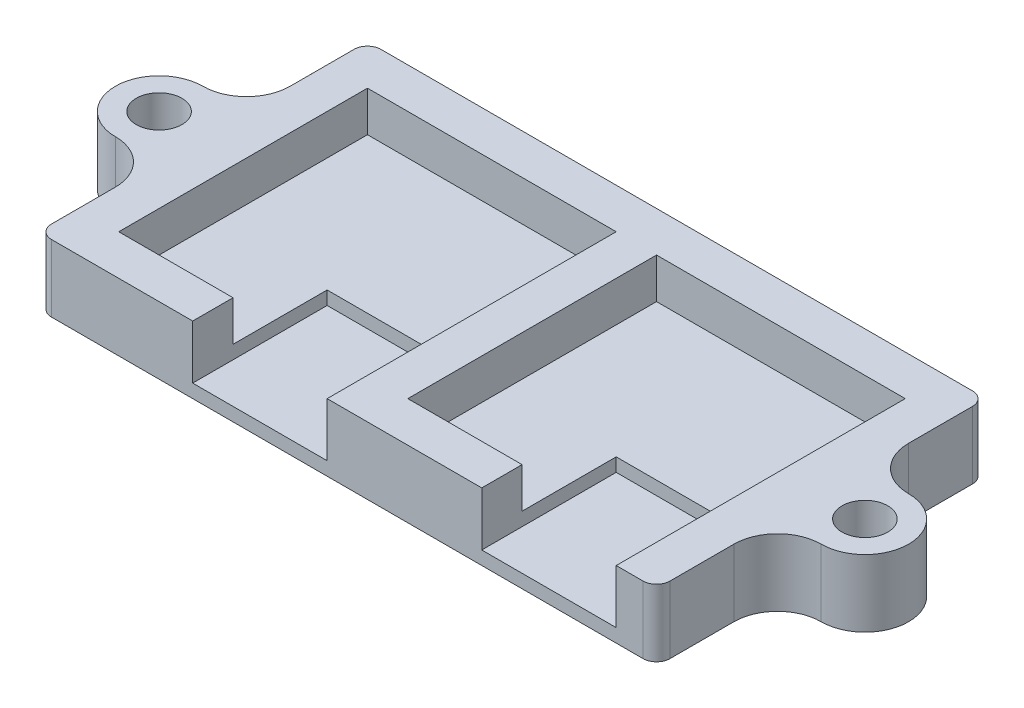
ISO-10303-21;
HEADER;
FILE_DESCRIPTION(('STEP AP214'),'2;1');
FILE_NAME('part.step','',(''),(''),'','','');
FILE_SCHEMA(('AUTOMOTIVE_DESIGN { 1 0 10303 214 1 1 1 1 }'));
ENDSEC;
DATA;
#1=APPLICATION_CONTEXT('core data for automotive mechanical design processes');
#2=APPLICATION_PROTOCOL_DEFINITION('international standard','automotive_design',2000,#1);
#3=PRODUCT_CONTEXT('',#1,'mechanical');
#4=PRODUCT('Part','Part','',(#3));
#5=PRODUCT_RELATED_PRODUCT_CATEGORY('part','',(#4));
#6=PRODUCT_DEFINITION_FORMATION('','',#4);
#7=PRODUCT_DEFINITION_CONTEXT('part definition',#1,'design');
#8=PRODUCT_DEFINITION('design','',#6,#7);
#9=PRODUCT_DEFINITION_SHAPE('','',#8);
#10=(LENGTH_UNIT() NAMED_UNIT(*) SI_UNIT(.MILLI.,.METRE.));
#11=(NAMED_UNIT(*) PLANE_ANGLE_UNIT() SI_UNIT($,.RADIAN.));
#12=(NAMED_UNIT(*) SI_UNIT($,.STERADIAN.) SOLID_ANGLE_UNIT());
#13=UNCERTAINTY_MEASURE_WITH_UNIT(LENGTH_MEASURE(1.E-05),#10,'distance_accuracy_value','');
#14=(GEOMETRIC_REPRESENTATION_CONTEXT(3) GLOBAL_UNCERTAINTY_ASSIGNED_CONTEXT((#13)) GLOBAL_UNIT_ASSIGNED_CONTEXT((#10,
#11,#12)) REPRESENTATION_CONTEXT('',''));
#15=CARTESIAN_POINT('',(0.,0.,0.));
#16=DIRECTION('',(0.,0.,1.));
#17=DIRECTION('',(1.,0.,0.));
#18=AXIS2_PLACEMENT_3D('',#15,#16,#17);
#19=CARTESIAN_POINT('',(-22.,2.,11.25));
#20=DIRECTION('',(0.,1.,0.));
#21=DIRECTION('',(0.,0.,1.));
#22=AXIS2_PLACEMENT_3D('',#19,#20,#21);
#23=PLANE('',#22);
#24=DIRECTION('',(1.,0.,0.));
#25=VECTOR('',#24,1.);
#26=CARTESIAN_POINT('',(0.,2.,2.25));
#27=LINE('',#26,#25);
#28=CARTESIAN_POINT('',(10.,2.,2.25));
#29=VERTEX_POINT('',#28);
#30=CARTESIAN_POINT('',(20.,2.,2.25));
#31=VERTEX_POINT('',#30);
#32=EDGE_CURVE('E873',#29,#31,#27,.T.);
#33=ORIENTED_EDGE('',*,*,#32,.T.);
#34=DIRECTION('',(0.,0.,-1.));
#35=VECTOR('',#34,1.);
#36=CARTESIAN_POINT('',(20.,2.,11.25));
#37=LINE('',#36,#35);
#38=CARTESIAN_POINT('',(20.,2.,-9.25));
#39=VERTEX_POINT('',#38);
#40=EDGE_CURVE('E12',#31,#39,#37,.T.);
#41=ORIENTED_EDGE('',*,*,#40,.T.);
#42=DIRECTION('',(-1.,0.,0.));
#43=VECTOR('',#42,1.);
#44=CARTESIAN_POINT('',(-22.,2.,-9.25));
#45=LINE('',#44,#43);
#46=CARTESIAN_POINT('',(1.5,2.,-9.25));
#47=VERTEX_POINT('',#46);
#48=EDGE_CURVE('E488',#39,#47,#45,.T.);
#49=ORIENTED_EDGE('',*,*,#48,.T.);
#50=DIRECTION('',(0.,0.,-1.));
#51=VECTOR('',#50,1.);
#52=CARTESIAN_POINT('',(1.5,2.,11.25));
#53=LINE('',#52,#51);
#54=CARTESIAN_POINT('',(1.5,2.,9.25));
#55=VERTEX_POINT('',#54);
#56=EDGE_CURVE('E825',#55,#47,#53,.T.);
#57=ORIENTED_EDGE('',*,*,#56,.F.);
#58=DIRECTION('',(-1.,0.,0.));
#59=VECTOR('',#58,1.);
#60=CARTESIAN_POINT('',(-22.,2.,9.25));
#61=LINE('',#60,#59);
#62=CARTESIAN_POINT('',(10.,2.,9.25));
#63=VERTEX_POINT('',#62);
#64=EDGE_CURVE('E819',#63,#55,#61,.T.);
#65=ORIENTED_EDGE('',*,*,#64,.F.);
#66=DIRECTION('',(0.,0.,1.));
#67=VECTOR('',#66,1.);
#68=CARTESIAN_POINT('',(10.,2.,0.));
#69=LINE('',#68,#67);
#70=EDGE_CURVE('E869',#29,#63,#69,.T.);
#71=ORIENTED_EDGE('',*,*,#70,.F.);
#72=EDGE_LOOP('',(#33,#41,#49,#57,#65,#71));
#73=FACE_BOUND('',#72,.T.);
#74=ADVANCED_FACE('F467',(#73),#23,.T.);
#75=DIRECTION('',(1.,0.,0.));
#76=VECTOR('',#75,1.);
#77=CARTESIAN_POINT('',(0.,2.,2.25));
#78=LINE('',#77,#76);
#79=CARTESIAN_POINT('',(-11.5,2.,2.25));
#80=VERTEX_POINT('',#79);
#81=CARTESIAN_POINT('',(-1.5,2.,2.25));
#82=VERTEX_POINT('',#81);
#83=EDGE_CURVE('E865',#80,#82,#78,.T.);
#84=ORIENTED_EDGE('',*,*,#83,.T.);
#85=DIRECTION('',(0.,0.,-1.));
#86=VECTOR('',#85,1.);
#87=CARTESIAN_POINT('',(-1.5,2.,11.25));
#88=LINE('',#87,#86);
#89=CARTESIAN_POINT('',(-1.5,2.,-9.25));
#90=VERTEX_POINT('',#89);
#91=EDGE_CURVE('E477',#82,#90,#88,.T.);
#92=ORIENTED_EDGE('',*,*,#91,.T.);
#93=DIRECTION('',(-1.,0.,0.));
#94=VECTOR('',#93,1.);
#95=CARTESIAN_POINT('',(-22.,2.,-9.25));
#96=LINE('',#95,#94);
#97=CARTESIAN_POINT('',(-20.,2.,-9.25));
#98=VERTEX_POINT('',#97);
#99=EDGE_CURVE('E816',#90,#98,#96,.T.);
#100=ORIENTED_EDGE('',*,*,#99,.T.);
#101=DIRECTION('',(0.,0.,-1.));
#102=VECTOR('',#101,1.);
#103=CARTESIAN_POINT('',(-20.,2.,11.25));
#104=LINE('',#103,#102);
#105=CARTESIAN_POINT('',(-20.,2.,9.25));
#106=VERTEX_POINT('',#105);
#107=EDGE_CURVE('E811',#106,#98,#104,.T.);
#108=ORIENTED_EDGE('',*,*,#107,.F.);
#109=DIRECTION('',(-1.,0.,0.));
#110=VECTOR('',#109,1.);
#111=CARTESIAN_POINT('',(-22.,2.,9.25));
#112=LINE('',#111,#110);
#113=CARTESIAN_POINT('',(-11.5,2.,9.25));
#114=VERTEX_POINT('',#113);
#115=EDGE_CURVE('E807',#114,#106,#112,.T.);
#116=ORIENTED_EDGE('',*,*,#115,.F.);
#117=DIRECTION('',(0.,0.,1.));
#118=VECTOR('',#117,1.);
#119=CARTESIAN_POINT('',(-11.5,2.,0.));
#120=LINE('',#119,#118);
#121=EDGE_CURVE('E861',#80,#114,#120,.T.);
#122=ORIENTED_EDGE('',*,*,#121,.F.);
#123=EDGE_LOOP('',(#84,#92,#100,#108,#116,#122));
#124=FACE_BOUND('',#123,.T.);
#125=ADVANCED_FACE('F1129',(#124),#23,.T.);
#126=CARTESIAN_POINT('',(0.,1.,0.));
#127=DIRECTION('',(0.,1.,0.));
#128=DIRECTION('',(0.,0.,1.));
#129=AXIS2_PLACEMENT_3D('',#126,#127,#128);
#130=PLANE('',#129);
#131=DIRECTION('',(-1.,0.,0.));
#132=VECTOR('',#131,1.);
#133=CARTESIAN_POINT('',(0.,1.,12.25));
#134=LINE('',#133,#132);
#135=CARTESIAN_POINT('',(20.,1.,12.25));
#136=VERTEX_POINT('',#135);
#137=CARTESIAN_POINT('',(10.,1.,12.25));
#138=VERTEX_POINT('',#137);
#139=EDGE_CURVE('E927',#136,#138,#134,.T.);
#140=ORIENTED_EDGE('',*,*,#139,.F.);
#141=DIRECTION('',(0.,0.,-1.));
#142=VECTOR('',#141,1.);
#143=CARTESIAN_POINT('',(20.,1.,0.));
#144=LINE('',#143,#142);
#145=CARTESIAN_POINT('',(20.,1.,2.25));
#146=VERTEX_POINT('',#145);
#147=EDGE_CURVE('E866',#136,#146,#144,.T.);
#148=ORIENTED_EDGE('',*,*,#147,.T.);
#149=DIRECTION('',(1.,0.,0.));
#150=VECTOR('',#149,1.);
#151=CARTESIAN_POINT('',(0.,1.,2.25));
#152=LINE('',#151,#150);
#153=CARTESIAN_POINT('',(10.,1.,2.25));
#154=VERTEX_POINT('',#153);
#155=EDGE_CURVE('E892',#154,#146,#152,.T.);
#156=ORIENTED_EDGE('',*,*,#155,.F.);
#157=DIRECTION('',(0.,0.,1.));
#158=VECTOR('',#157,1.);
#159=CARTESIAN_POINT('',(10.,1.,0.));
#160=LINE('',#159,#158);
#161=EDGE_CURVE('E888',#154,#138,#160,.T.);
#162=ORIENTED_EDGE('',*,*,#161,.T.);
#163=EDGE_LOOP('',(#140,#148,#156,#162));
#164=FACE_BOUND('',#163,.T.);
#165=ADVANCED_FACE('F1072',(#164),#130,.T.);
#166=CARTESIAN_POINT('',(-1.5,1.,12.25));
#167=VERTEX_POINT('',#166);
#168=CARTESIAN_POINT('',(-11.5,1.,12.25));
#169=VERTEX_POINT('',#168);
#170=EDGE_CURVE('E923',#167,#169,#134,.T.);
#171=ORIENTED_EDGE('',*,*,#170,.F.);
#172=DIRECTION('',(0.,0.,-1.));
#173=VECTOR('',#172,1.);
#174=CARTESIAN_POINT('',(-1.5,1.,0.));
#175=LINE('',#174,#173);
#176=CARTESIAN_POINT('',(-1.5,1.,2.25));
#177=VERTEX_POINT('',#176);
#178=EDGE_CURVE('E884',#167,#177,#175,.T.);
#179=ORIENTED_EDGE('',*,*,#178,.T.);
#180=DIRECTION('',(1.,0.,0.));
#181=VECTOR('',#180,1.);
#182=CARTESIAN_POINT('',(0.,1.,2.25));
#183=LINE('',#182,#181);
#184=CARTESIAN_POINT('',(-11.5,1.,2.25));
#185=VERTEX_POINT('',#184);
#186=EDGE_CURVE('E880',#185,#177,#183,.T.);
#187=ORIENTED_EDGE('',*,*,#186,.F.);
#188=DIRECTION('',(0.,0.,1.));
#189=VECTOR('',#188,1.);
#190=CARTESIAN_POINT('',(-11.5,1.,0.));
#191=LINE('',#190,#189);
#192=EDGE_CURVE('E860',#185,#169,#191,.T.);
#193=ORIENTED_EDGE('',*,*,#192,.T.);
#194=EDGE_LOOP('',(#171,#179,#187,#193));
#195=FACE_BOUND('',#194,.T.);
#196=ADVANCED_FACE('F1091',(#195),#130,.T.);
#197=CARTESIAN_POINT('',(-22.,1.,11.25));
#198=DIRECTION('',(0.,-1.,0.));
#199=DIRECTION('',(0.,0.,-1.));
#200=AXIS2_PLACEMENT_3D('',#197,#198,#199);
#201=CYLINDRICAL_SURFACE('',#200,1.);
#202=CARTESIAN_POINT('',(-22.,0.,11.25));
#203=DIRECTION('',(0.,1.,0.));
#204=DIRECTION('',(0.,0.,1.));
#205=AXIS2_PLACEMENT_3D('',#202,#203,#204);
#206=CIRCLE('',#205,1.);
#207=CARTESIAN_POINT('',(-22.,0.,12.25));
#208=VERTEX_POINT('',#207);
#209=CARTESIAN_POINT('',(-23.,0.,11.25));
#210=VERTEX_POINT('',#209);
#211=EDGE_CURVE('E922',#208,#210,#206,.F.);
#212=ORIENTED_EDGE('',*,*,#211,.F.);
#213=DIRECTION('',(0.,-1.,0.));
#214=VECTOR('',#213,1.);
#215=CARTESIAN_POINT('',(-22.,1.,12.25));
#216=LINE('',#215,#214);
#217=CARTESIAN_POINT('',(-22.,5.,12.25));
#218=VERTEX_POINT('',#217);
#219=EDGE_CURVE('E471',#218,#208,#216,.T.);
#220=ORIENTED_EDGE('',*,*,#219,.F.);
#221=CARTESIAN_POINT('',(-22.,5.,11.25));
#222=DIRECTION('',(0.,1.,0.));
#223=DIRECTION('',(0.,0.,1.));
#224=AXIS2_PLACEMENT_3D('',#221,#222,#223);
#225=CIRCLE('',#224,1.);
#226=CARTESIAN_POINT('',(-23.,5.,11.25));
#227=VERTEX_POINT('',#226);
#228=EDGE_CURVE('E732',#227,#218,#225,.T.);
#229=ORIENTED_EDGE('',*,*,#228,.F.);
#230=DIRECTION('',(0.,-1.,0.));
#231=VECTOR('',#230,1.);
#232=CARTESIAN_POINT('',(-23.,1.,11.25));
#233=LINE('',#232,#231);
#234=EDGE_CURVE('E987',#227,#210,#233,.T.);
#235=ORIENTED_EDGE('',*,*,#234,.T.);
#236=EDGE_LOOP('',(#212,#220,#229,#235));
#237=FACE_BOUND('',#236,.T.);
#238=ADVANCED_FACE('F469',(#237),#201,.T.);
#239=CARTESIAN_POINT('',(0.,1.,12.25));
#240=DIRECTION('',(0.,0.,1.));
#241=DIRECTION('',(1.,0.,0.));
#242=AXIS2_PLACEMENT_3D('',#239,#240,#241);
#243=PLANE('',#242);
#244=DIRECTION('',(-1.,0.,0.));
#245=VECTOR('',#244,1.);
#246=CARTESIAN_POINT('',(0.,0.,12.25));
#247=LINE('',#246,#245);
#248=CARTESIAN_POINT('',(22.,0.,12.25));
#249=VERTEX_POINT('',#248);
#250=EDGE_CURVE('E932',#249,#208,#247,.T.);
#251=ORIENTED_EDGE('',*,*,#250,.F.);
#252=DIRECTION('',(0.,-1.,0.));
#253=VECTOR('',#252,1.);
#254=CARTESIAN_POINT('',(22.,1.,12.25));
#255=LINE('',#254,#253);
#256=CARTESIAN_POINT('',(22.,5.,12.25));
#257=VERTEX_POINT('',#256);
#258=EDGE_CURVE('E1026',#257,#249,#255,.T.);
#259=ORIENTED_EDGE('',*,*,#258,.F.);
#260=DIRECTION('',(1.,0.,0.));
#261=VECTOR('',#260,1.);
#262=CARTESIAN_POINT('',(-22.,5.,12.25));
#263=LINE('',#262,#261);
#264=CARTESIAN_POINT('',(20.,5.,12.25));
#265=VERTEX_POINT('',#264);
#266=EDGE_CURVE('E780',#265,#257,#263,.T.);
#267=ORIENTED_EDGE('',*,*,#266,.F.);
#268=DIRECTION('',(0.,-1.,0.));
#269=VECTOR('',#268,1.);
#270=CARTESIAN_POINT('',(20.,2.,12.25));
#271=LINE('',#270,#269);
#272=EDGE_CURVE('E876',#265,#136,#271,.T.);
#273=ORIENTED_EDGE('',*,*,#272,.T.);
#274=ORIENTED_EDGE('',*,*,#139,.T.);
#275=DIRECTION('',(0.,-1.,0.));
#276=VECTOR('',#275,1.);
#277=CARTESIAN_POINT('',(10.,2.,12.25));
#278=LINE('',#277,#276);
#279=CARTESIAN_POINT('',(10.,5.,12.25));
#280=VERTEX_POINT('',#279);
#281=EDGE_CURVE('E907',#280,#138,#278,.T.);
#282=ORIENTED_EDGE('',*,*,#281,.F.);
#283=DIRECTION('',(1.,0.,0.));
#284=VECTOR('',#283,1.);
#285=CARTESIAN_POINT('',(-22.,5.,12.25));
#286=LINE('',#285,#284);
#287=CARTESIAN_POINT('',(-1.5,5.,12.25));
#288=VERTEX_POINT('',#287);
#289=EDGE_CURVE('E758',#288,#280,#286,.T.);
#290=ORIENTED_EDGE('',*,*,#289,.F.);
#291=DIRECTION('',(0.,-1.,0.));
#292=VECTOR('',#291,1.);
#293=CARTESIAN_POINT('',(-1.5,2.,12.25));
#294=LINE('',#293,#292);
#295=EDGE_CURVE('E910',#288,#167,#294,.T.);
#296=ORIENTED_EDGE('',*,*,#295,.T.);
#297=ORIENTED_EDGE('',*,*,#170,.T.);
#298=DIRECTION('',(0.,-1.,0.));
#299=VECTOR('',#298,1.);
#300=CARTESIAN_POINT('',(-11.5,2.,12.25));
#301=LINE('',#300,#299);
#302=CARTESIAN_POINT('',(-11.5,5.,12.25));
#303=VERTEX_POINT('',#302);
#304=EDGE_CURVE('E919',#303,#169,#301,.T.);
#305=ORIENTED_EDGE('',*,*,#304,.F.);
#306=DIRECTION('',(1.,0.,0.));
#307=VECTOR('',#306,1.);
#308=CARTESIAN_POINT('',(-22.,5.,12.25));
#309=LINE('',#308,#307);
#310=EDGE_CURVE('E736',#218,#303,#309,.T.);
#311=ORIENTED_EDGE('',*,*,#310,.F.);
#312=ORIENTED_EDGE('',*,*,#219,.T.);
#313=EDGE_LOOP('',(#251,#259,#267,#273,#274,#282,#290,#296,#297,#305,#311,#312));
#314=FACE_BOUND('',#313,.T.);
#315=ADVANCED_FACE('F1036',(#314),#243,.T.);
#316=CARTESIAN_POINT('',(22.,1.,11.25));
#317=DIRECTION('',(0.,-1.,0.));
#318=DIRECTION('',(0.,0.,-1.));
#319=AXIS2_PLACEMENT_3D('',#316,#317,#318);
#320=CYLINDRICAL_SURFACE('',#319,1.);
#321=CARTESIAN_POINT('',(22.,0.,11.25));
#322=DIRECTION('',(0.,1.,0.));
#323=DIRECTION('',(0.,0.,1.));
#324=AXIS2_PLACEMENT_3D('',#321,#322,#323);
#325=CIRCLE('',#324,1.);
#326=CARTESIAN_POINT('',(23.,0.,11.25));
#327=VERTEX_POINT('',#326);
#328=EDGE_CURVE('E936',#249,#327,#325,.T.);
#329=ORIENTED_EDGE('',*,*,#328,.T.);
#330=DIRECTION('',(0.,-1.,0.));
#331=VECTOR('',#330,1.);
#332=CARTESIAN_POINT('',(23.,1.,11.25));
#333=LINE('',#332,#331);
#334=CARTESIAN_POINT('',(23.,5.,11.25));
#335=VERTEX_POINT('',#334);
#336=EDGE_CURVE('E1023',#335,#327,#333,.T.);
#337=ORIENTED_EDGE('',*,*,#336,.F.);
#338=CARTESIAN_POINT('',(22.,5.,11.25));
#339=DIRECTION('',(0.,1.,0.));
#340=DIRECTION('',(0.,0.,1.));
#341=AXIS2_PLACEMENT_3D('',#338,#339,#340);
#342=CIRCLE('',#341,1.);
#343=EDGE_CURVE('E784',#257,#335,#342,.T.);
#344=ORIENTED_EDGE('',*,*,#343,.F.);
#345=ORIENTED_EDGE('',*,*,#258,.T.);
#346=EDGE_LOOP('',(#329,#337,#344,#345));
#347=FACE_BOUND('',#346,.T.);
#348=ADVANCED_FACE('F1046',(#347),#320,.T.);
#349=CARTESIAN_POINT('',(23.,1.,0.));
#350=DIRECTION('',(-1.,0.,0.));
#351=DIRECTION('',(0.,0.,1.));
#352=AXIS2_PLACEMENT_3D('',#349,#350,#351);
#353=PLANE('',#352);
#354=DIRECTION('',(0.,0.,-1.));
#355=VECTOR('',#354,1.);
#356=CARTESIAN_POINT('',(23.,0.,0.));
#357=LINE('',#356,#355);
#358=CARTESIAN_POINT('',(23.,0.,6.49999999999983));
#359=VERTEX_POINT('',#358);
#360=EDGE_CURVE('E939',#327,#359,#357,.T.);
#361=ORIENTED_EDGE('',*,*,#360,.T.);
#362=DIRECTION('',(0.,-1.,0.));
#363=VECTOR('',#362,1.);
#364=CARTESIAN_POINT('',(23.,1.,6.49999999999983));
#365=LINE('',#364,#363);
#366=CARTESIAN_POINT('',(23.,5.,6.49999999999983));
#367=VERTEX_POINT('',#366);
#368=EDGE_CURVE('E1019',#367,#359,#365,.T.);
#369=ORIENTED_EDGE('',*,*,#368,.F.);
#370=DIRECTION('',(0.,0.,1.));
#371=VECTOR('',#370,1.);
#372=CARTESIAN_POINT('',(23.,5.,11.25));
#373=LINE('',#372,#371);
#374=EDGE_CURVE('E788',#367,#335,#373,.T.);
#375=ORIENTED_EDGE('',*,*,#374,.T.);
#376=ORIENTED_EDGE('',*,*,#336,.T.);
#377=EDGE_LOOP('',(#361,#369,#375,#376));
#378=FACE_BOUND('',#377,.T.);
#379=ADVANCED_FACE('F1048',(#378),#353,.F.);
#380=CARTESIAN_POINT('',(26.25,1.,6.49999999999983));
#381=DIRECTION('',(0.,-1.,0.));
#382=DIRECTION('',(0.,0.,-1.));
#383=AXIS2_PLACEMENT_3D('',#380,#381,#382);
#384=CYLINDRICAL_SURFACE('',#383,3.25);
#385=CARTESIAN_POINT('',(26.25,0.,6.49999999999983));
#386=DIRECTION('',(0.,1.,0.));
#387=DIRECTION('',(0.,0.,1.));
#388=AXIS2_PLACEMENT_3D('',#385,#386,#387);
#389=CIRCLE('',#388,3.25);
#390=CARTESIAN_POINT('',(26.25,0.,3.24999999999983));
#391=VERTEX_POINT('',#390);
#392=EDGE_CURVE('E942',#359,#391,#389,.F.);
#393=ORIENTED_EDGE('',*,*,#392,.T.);
#394=DIRECTION('',(0.,-1.,0.));
#395=VECTOR('',#394,1.);
#396=CARTESIAN_POINT('',(26.25,1.,3.24999999999983));
#397=LINE('',#396,#395);
#398=CARTESIAN_POINT('',(26.25,5.,3.24999999999983));
#399=VERTEX_POINT('',#398);
#400=EDGE_CURVE('E1016',#399,#391,#397,.T.);
#401=ORIENTED_EDGE('',*,*,#400,.F.);
#402=CARTESIAN_POINT('',(26.25,5.,6.49999999999983));
#403=DIRECTION('',(0.,1.,0.));
#404=DIRECTION('',(0.,0.,1.));
#405=AXIS2_PLACEMENT_3D('',#402,#403,#404);
#406=CIRCLE('',#405,3.25);
#407=EDGE_CURVE('E792',#399,#367,#406,.T.);
#408=ORIENTED_EDGE('',*,*,#407,.T.);
#409=ORIENTED_EDGE('',*,*,#368,.T.);
#410=EDGE_LOOP('',(#393,#401,#408,#409));
#411=FACE_BOUND('',#410,.T.);
#412=ADVANCED_FACE('F1052',(#411),#384,.F.);
#413=CARTESIAN_POINT('',(26.25,1.,-1.66533453693773E-13));
#414=DIRECTION('',(0.,-1.,0.));
#415=DIRECTION('',(0.,0.,-1.));
#416=AXIS2_PLACEMENT_3D('',#413,#414,#415);
#417=CYLINDRICAL_SURFACE('',#416,3.25);
#418=CARTESIAN_POINT('',(26.25,0.,-1.66533453693773E-13));
#419=DIRECTION('',(0.,1.,0.));
#420=DIRECTION('',(0.,0.,1.));
#421=AXIS2_PLACEMENT_3D('',#418,#419,#420);
#422=CIRCLE('',#421,3.25);
#423=CARTESIAN_POINT('',(26.25,0.,-3.25000000000017));
#424=VERTEX_POINT('',#423);
#425=EDGE_CURVE('E947',#424,#391,#422,.F.);
#426=ORIENTED_EDGE('',*,*,#425,.F.);
#427=DIRECTION('',(0.,-1.,0.));
#428=VECTOR('',#427,1.);
#429=CARTESIAN_POINT('',(26.25,1.,-3.25000000000017));
#430=LINE('',#429,#428);
#431=CARTESIAN_POINT('',(26.25,5.,-3.25000000000017));
#432=VERTEX_POINT('',#431);
#433=EDGE_CURVE('E1013',#432,#424,#430,.T.);
#434=ORIENTED_EDGE('',*,*,#433,.F.);
#435=CARTESIAN_POINT('',(26.25,5.,-1.66533453693773E-13));
#436=DIRECTION('',(0.,1.,0.));
#437=DIRECTION('',(0.,0.,1.));
#438=AXIS2_PLACEMENT_3D('',#435,#436,#437);
#439=CIRCLE('',#438,3.25);
#440=EDGE_CURVE('E796',#399,#432,#439,.T.);
#441=ORIENTED_EDGE('',*,*,#440,.F.);
#442=ORIENTED_EDGE('',*,*,#400,.T.);
#443=EDGE_LOOP('',(#426,#434,#441,#442));
#444=FACE_BOUND('',#443,.T.);
#445=ADVANCED_FACE('F1056',(#444),#417,.T.);
#446=CARTESIAN_POINT('',(26.25,1.,-6.50000000000017));
#447=DIRECTION('',(0.,-1.,0.));
#448=DIRECTION('',(0.,0.,-1.));
#449=AXIS2_PLACEMENT_3D('',#446,#447,#448);
#450=CYLINDRICAL_SURFACE('',#449,3.25);
#451=CARTESIAN_POINT('',(26.25,0.,-6.50000000000017));
#452=DIRECTION('',(0.,1.,0.));
#453=DIRECTION('',(0.,0.,1.));
#454=AXIS2_PLACEMENT_3D('',#451,#452,#453);
#455=CIRCLE('',#454,3.25);
#456=CARTESIAN_POINT('',(23.,0.,-6.50000000000017));
#457=VERTEX_POINT('',#456);
#458=EDGE_CURVE('E951',#424,#457,#455,.F.);
#459=ORIENTED_EDGE('',*,*,#458,.T.);
#460=DIRECTION('',(0.,-1.,0.));
#461=VECTOR('',#460,1.);
#462=CARTESIAN_POINT('',(23.,1.,-6.50000000000017));
#463=LINE('',#462,#461);
#464=CARTESIAN_POINT('',(23.,5.,-6.50000000000017));
#465=VERTEX_POINT('',#464);
#466=EDGE_CURVE('E1009',#465,#457,#463,.T.);
#467=ORIENTED_EDGE('',*,*,#466,.F.);
#468=CARTESIAN_POINT('',(26.25,5.,-6.50000000000017));
#469=DIRECTION('',(0.,1.,0.));
#470=DIRECTION('',(0.,0.,1.));
#471=AXIS2_PLACEMENT_3D('',#468,#469,#470);
#472=CIRCLE('',#471,3.25);
#473=EDGE_CURVE('E800',#465,#432,#472,.T.);
#474=ORIENTED_EDGE('',*,*,#473,.T.);
#475=ORIENTED_EDGE('',*,*,#433,.T.);
#476=EDGE_LOOP('',(#459,#467,#474,#475));
#477=FACE_BOUND('',#476,.T.);
#478=ADVANCED_FACE('F1058',(#477),#450,.F.);
#479=CARTESIAN_POINT('',(23.,0.,-11.25));
#480=VERTEX_POINT('',#479);
#481=EDGE_CURVE('E943',#457,#480,#357,.T.);
#482=ORIENTED_EDGE('',*,*,#481,.T.);
#483=DIRECTION('',(0.,-1.,0.));
#484=VECTOR('',#483,1.);
#485=CARTESIAN_POINT('',(23.,1.,-11.25));
#486=LINE('',#485,#484);
#487=CARTESIAN_POINT('',(23.,5.,-11.25));
#488=VERTEX_POINT('',#487);
#489=EDGE_CURVE('E688',#488,#480,#486,.T.);
#490=ORIENTED_EDGE('',*,*,#489,.F.);
#491=DIRECTION('',(0.,0.,1.));
#492=VECTOR('',#491,1.);
#493=CARTESIAN_POINT('',(23.,5.,11.25));
#494=LINE('',#493,#492);
#495=EDGE_CURVE('E699',#488,#465,#494,.T.);
#496=ORIENTED_EDGE('',*,*,#495,.T.);
#497=ORIENTED_EDGE('',*,*,#466,.T.);
#498=EDGE_LOOP('',(#482,#490,#496,#497));
#499=FACE_BOUND('',#498,.T.);
#500=ADVANCED_FACE('F1062',(#499),#353,.F.);
#501=CARTESIAN_POINT('',(22.,1.,-11.25));
#502=DIRECTION('',(0.,-1.,0.));
#503=DIRECTION('',(0.,0.,-1.));
#504=AXIS2_PLACEMENT_3D('',#501,#502,#503);
#505=CYLINDRICAL_SURFACE('',#504,1.);
#506=CARTESIAN_POINT('',(22.,0.,-11.25));
#507=DIRECTION('',(0.,1.,0.));
#508=DIRECTION('',(0.,0.,1.));
#509=AXIS2_PLACEMENT_3D('',#506,#507,#508);
#510=CIRCLE('',#509,1.);
#511=CARTESIAN_POINT('',(22.,0.,-12.25));
#512=VERTEX_POINT('',#511);
#513=EDGE_CURVE('E683',#480,#512,#510,.T.);
#514=ORIENTED_EDGE('',*,*,#513,.T.);
#515=DIRECTION('',(0.,-1.,0.));
#516=VECTOR('',#515,1.);
#517=CARTESIAN_POINT('',(22.,1.,-12.25));
#518=LINE('',#517,#516);
#519=CARTESIAN_POINT('',(22.,5.,-12.25));
#520=VERTEX_POINT('',#519);
#521=EDGE_CURVE('E676',#520,#512,#518,.T.);
#522=ORIENTED_EDGE('',*,*,#521,.F.);
#523=CARTESIAN_POINT('',(22.,5.,-11.25));
#524=DIRECTION('',(0.,1.,0.));
#525=DIRECTION('',(0.,0.,1.));
#526=AXIS2_PLACEMENT_3D('',#523,#524,#525);
#527=CIRCLE('',#526,1.);
#528=EDGE_CURVE('E680',#488,#520,#527,.T.);
#529=ORIENTED_EDGE('',*,*,#528,.F.);
#530=ORIENTED_EDGE('',*,*,#489,.T.);
#531=EDGE_LOOP('',(#514,#522,#529,#530));
#532=FACE_BOUND('',#531,.T.);
#533=ADVANCED_FACE('F678',(#532),#505,.T.);
#534=CARTESIAN_POINT('',(0.,1.,-12.25));
#535=DIRECTION('',(0.,0.,1.));
#536=DIRECTION('',(1.,0.,0.));
#537=AXIS2_PLACEMENT_3D('',#534,#535,#536);
#538=PLANE('',#537);
#539=DIRECTION('',(-1.,0.,0.));
#540=VECTOR('',#539,1.);
#541=CARTESIAN_POINT('',(0.,0.,-12.25));
#542=LINE('',#541,#540);
#543=CARTESIAN_POINT('',(-22.,0.,-12.25));
#544=VERTEX_POINT('',#543);
#545=EDGE_CURVE('E956',#512,#544,#542,.T.);
#546=ORIENTED_EDGE('',*,*,#545,.T.);
#547=DIRECTION('',(0.,-1.,0.));
#548=VECTOR('',#547,1.);
#549=CARTESIAN_POINT('',(-22.,1.,-12.25));
#550=LINE('',#549,#548);
#551=CARTESIAN_POINT('',(-22.,5.,-12.25));
#552=VERTEX_POINT('',#551);
#553=EDGE_CURVE('E689',#552,#544,#550,.T.);
#554=ORIENTED_EDGE('',*,*,#553,.F.);
#555=DIRECTION('',(1.,0.,0.));
#556=VECTOR('',#555,1.);
#557=CARTESIAN_POINT('',(-22.,5.,-12.25));
#558=LINE('',#557,#556);
#559=EDGE_CURVE('E696',#552,#520,#558,.T.);
#560=ORIENTED_EDGE('',*,*,#559,.T.);
#561=ORIENTED_EDGE('',*,*,#521,.T.);
#562=EDGE_LOOP('',(#546,#554,#560,#561));
#563=FACE_BOUND('',#562,.T.);
#564=ADVANCED_FACE('F702',(#563),#538,.F.);
#565=CARTESIAN_POINT('',(-22.,1.,-11.25));
#566=DIRECTION('',(0.,-1.,0.));
#567=DIRECTION('',(0.,0.,-1.));
#568=AXIS2_PLACEMENT_3D('',#565,#566,#567);
#569=CYLINDRICAL_SURFACE('',#568,1.);
#570=CARTESIAN_POINT('',(-22.,0.,-11.25));
#571=DIRECTION('',(0.,1.,0.));
#572=DIRECTION('',(0.,0.,1.));
#573=AXIS2_PLACEMENT_3D('',#570,#571,#572);
#574=CIRCLE('',#573,1.);
#575=CARTESIAN_POINT('',(-23.,0.,-11.25));
#576=VERTEX_POINT('',#575);
#577=EDGE_CURVE('E959',#544,#576,#574,.T.);
#578=ORIENTED_EDGE('',*,*,#577,.T.);
#579=DIRECTION('',(0.,-1.,0.));
#580=VECTOR('',#579,1.);
#581=CARTESIAN_POINT('',(-23.,1.,-11.25));
#582=LINE('',#581,#580);
#583=CARTESIAN_POINT('',(-23.,5.,-11.25));
#584=VERTEX_POINT('',#583);
#585=EDGE_CURVE('E1002',#584,#576,#582,.T.);
#586=ORIENTED_EDGE('',*,*,#585,.F.);
#587=CARTESIAN_POINT('',(-22.,5.,-11.25));
#588=DIRECTION('',(0.,1.,0.));
#589=DIRECTION('',(0.,0.,1.));
#590=AXIS2_PLACEMENT_3D('',#587,#588,#589);
#591=CIRCLE('',#590,1.);
#592=EDGE_CURVE('E706',#552,#584,#591,.T.);
#593=ORIENTED_EDGE('',*,*,#592,.F.);
#594=ORIENTED_EDGE('',*,*,#553,.T.);
#595=EDGE_LOOP('',(#578,#586,#593,#594));
#596=FACE_BOUND('',#595,.T.);
#597=ADVANCED_FACE('F1118',(#596),#569,.T.);
#598=CARTESIAN_POINT('',(-23.,1.,0.));
#599=DIRECTION('',(-1.,0.,0.));
#600=DIRECTION('',(0.,0.,1.));
#601=AXIS2_PLACEMENT_3D('',#598,#599,#600);
#602=PLANE('',#601);
#603=DIRECTION('',(0.,0.,-1.));
#604=VECTOR('',#603,1.);
#605=CARTESIAN_POINT('',(-23.,0.,0.));
#606=LINE('',#605,#604);
#607=CARTESIAN_POINT('',(-23.,0.,-6.5));
#608=VERTEX_POINT('',#607);
#609=EDGE_CURVE('E963',#608,#576,#606,.T.);
#610=ORIENTED_EDGE('',*,*,#609,.F.);
#611=DIRECTION('',(0.,-1.,0.));
#612=VECTOR('',#611,1.);
#613=CARTESIAN_POINT('',(-23.,1.,-6.5));
#614=LINE('',#613,#612);
#615=CARTESIAN_POINT('',(-23.,5.,-6.5));
#616=VERTEX_POINT('',#615);
#617=EDGE_CURVE('E999',#616,#608,#614,.T.);
#618=ORIENTED_EDGE('',*,*,#617,.F.);
#619=DIRECTION('',(0.,0.,1.));
#620=VECTOR('',#619,1.);
#621=CARTESIAN_POINT('',(-23.,5.,11.25));
#622=LINE('',#621,#620);
#623=EDGE_CURVE('E709',#584,#616,#622,.T.);
#624=ORIENTED_EDGE('',*,*,#623,.F.);
#625=ORIENTED_EDGE('',*,*,#585,.T.);
#626=EDGE_LOOP('',(#610,#618,#624,#625));
#627=FACE_BOUND('',#626,.T.);
#628=ADVANCED_FACE('F1115',(#627),#602,.T.);
#629=CARTESIAN_POINT('',(-26.25,1.,-6.5));
#630=DIRECTION('',(0.,-1.,0.));
#631=DIRECTION('',(0.,0.,-1.));
#632=AXIS2_PLACEMENT_3D('',#629,#630,#631);
#633=CYLINDRICAL_SURFACE('',#632,3.25);
#634=CARTESIAN_POINT('',(-26.25,0.,-6.5));
#635=DIRECTION('',(0.,1.,0.));
#636=DIRECTION('',(0.,0.,1.));
#637=AXIS2_PLACEMENT_3D('',#634,#635,#636);
#638=CIRCLE('',#637,3.25);
#639=CARTESIAN_POINT('',(-26.25,0.,-3.25));
#640=VERTEX_POINT('',#639);
#641=EDGE_CURVE('E967',#640,#608,#638,.T.);
#642=ORIENTED_EDGE('',*,*,#641,.F.);
#643=DIRECTION('',(0.,-1.,0.));
#644=VECTOR('',#643,1.);
#645=CARTESIAN_POINT('',(-26.25,1.,-3.25));
#646=LINE('',#645,#644);
#647=CARTESIAN_POINT('',(-26.25,5.,-3.25));
#648=VERTEX_POINT('',#647);
#649=EDGE_CURVE('E996',#648,#640,#646,.T.);
#650=ORIENTED_EDGE('',*,*,#649,.F.);
#651=CARTESIAN_POINT('',(-26.25,5.,-6.5));
#652=DIRECTION('',(0.,1.,0.));
#653=DIRECTION('',(0.,0.,1.));
#654=AXIS2_PLACEMENT_3D('',#651,#652,#653);
#655=CIRCLE('',#654,3.25);
#656=EDGE_CURVE('E716',#648,#616,#655,.T.);
#657=ORIENTED_EDGE('',*,*,#656,.T.);
#658=ORIENTED_EDGE('',*,*,#617,.T.);
#659=EDGE_LOOP('',(#642,#650,#657,#658));
#660=FACE_BOUND('',#659,.T.);
#661=ADVANCED_FACE('F1111',(#660),#633,.F.);
#662=CARTESIAN_POINT('',(-26.25,1.,0.));
#663=DIRECTION('',(0.,-1.,0.));
#664=DIRECTION('',(0.,0.,-1.));
#665=AXIS2_PLACEMENT_3D('',#662,#663,#664);
#666=CYLINDRICAL_SURFACE('',#665,3.25);
#667=CARTESIAN_POINT('',(-26.25,0.,0.));
#668=DIRECTION('',(0.,1.,0.));
#669=DIRECTION('',(0.,0.,1.));
#670=AXIS2_PLACEMENT_3D('',#667,#668,#669);
#671=CIRCLE('',#670,3.25);
#672=CARTESIAN_POINT('',(-26.25,0.,3.25));
#673=VERTEX_POINT('',#672);
#674=EDGE_CURVE('E972',#640,#673,#671,.T.);
#675=ORIENTED_EDGE('',*,*,#674,.T.);
#676=DIRECTION('',(0.,-1.,0.));
#677=VECTOR('',#676,1.);
#678=CARTESIAN_POINT('',(-26.25,1.,3.25));
#679=LINE('',#678,#677);
#680=CARTESIAN_POINT('',(-26.25,5.,3.25));
#681=VERTEX_POINT('',#680);
#682=EDGE_CURVE('E993',#681,#673,#679,.T.);
#683=ORIENTED_EDGE('',*,*,#682,.F.);
#684=CARTESIAN_POINT('',(-26.25,5.,0.));
#685=DIRECTION('',(0.,1.,0.));
#686=DIRECTION('',(0.,0.,1.));
#687=AXIS2_PLACEMENT_3D('',#684,#685,#686);
#688=CIRCLE('',#687,3.25);
#689=EDGE_CURVE('E720',#648,#681,#688,.T.);
#690=ORIENTED_EDGE('',*,*,#689,.F.);
#691=ORIENTED_EDGE('',*,*,#649,.T.);
#692=EDGE_LOOP('',(#675,#683,#690,#691));
#693=FACE_BOUND('',#692,.T.);
#694=ADVANCED_FACE('F1108',(#693),#666,.T.);
#695=CARTESIAN_POINT('',(-26.25,1.,6.5));
#696=DIRECTION('',(0.,-1.,0.));
#697=DIRECTION('',(0.,0.,-1.));
#698=AXIS2_PLACEMENT_3D('',#695,#696,#697);
#699=CYLINDRICAL_SURFACE('',#698,3.25);
#700=CARTESIAN_POINT('',(-26.25,0.,6.5));
#701=DIRECTION('',(0.,1.,0.));
#702=DIRECTION('',(0.,0.,1.));
#703=AXIS2_PLACEMENT_3D('',#700,#701,#702);
#704=CIRCLE('',#703,3.25);
#705=CARTESIAN_POINT('',(-23.,0.,6.5));
#706=VERTEX_POINT('',#705);
#707=EDGE_CURVE('E976',#706,#673,#704,.T.);
#708=ORIENTED_EDGE('',*,*,#707,.F.);
#709=DIRECTION('',(0.,-1.,0.));
#710=VECTOR('',#709,1.);
#711=CARTESIAN_POINT('',(-23.,1.,6.5));
#712=LINE('',#711,#710);
#713=CARTESIAN_POINT('',(-23.,5.,6.5));
#714=VERTEX_POINT('',#713);
#715=EDGE_CURVE('E990',#714,#706,#712,.T.);
#716=ORIENTED_EDGE('',*,*,#715,.F.);
#717=CARTESIAN_POINT('',(-26.25,5.,6.5));
#718=DIRECTION('',(0.,1.,0.));
#719=DIRECTION('',(0.,0.,1.));
#720=AXIS2_PLACEMENT_3D('',#717,#718,#719);
#721=CIRCLE('',#720,3.25);
#722=EDGE_CURVE('E724',#714,#681,#721,.T.);
#723=ORIENTED_EDGE('',*,*,#722,.T.);
#724=ORIENTED_EDGE('',*,*,#682,.T.);
#725=EDGE_LOOP('',(#708,#716,#723,#724));
#726=FACE_BOUND('',#725,.T.);
#727=ADVANCED_FACE('F1105',(#726),#699,.F.);
#728=CARTESIAN_POINT('',(-26.25,1.,0.));
#729=DIRECTION('',(0.,-1.,0.));
#730=DIRECTION('',(0.,0.,-1.));
#731=AXIS2_PLACEMENT_3D('',#728,#729,#730);
#732=CYLINDRICAL_SURFACE('',#731,1.7);
#733=CARTESIAN_POINT('',(-26.25,0.,0.));
#734=DIRECTION('',(0.,1.,0.));
#735=DIRECTION('',(0.,0.,1.));
#736=AXIS2_PLACEMENT_3D('',#733,#734,#735);
#737=CIRCLE('',#736,1.7);
#738=CARTESIAN_POINT('',(-26.25,0.,1.7));
#739=VERTEX_POINT('',#738);
#740=EDGE_CURVE('E980',#739,#739,#737,.T.);
#741=ORIENTED_EDGE('',*,*,#740,.F.);
#742=EDGE_LOOP('',(#741));
#743=FACE_BOUND('',#742,.T.);
#744=CARTESIAN_POINT('',(-26.25,5.,0.));
#745=DIRECTION('',(0.,1.,0.));
#746=DIRECTION('',(0.,0.,1.));
#747=AXIS2_PLACEMENT_3D('',#744,#745,#746);
#748=CIRCLE('',#747,1.7);
#749=CARTESIAN_POINT('',(-26.25,5.,1.7));
#750=VERTEX_POINT('',#749);
#751=EDGE_CURVE('E1646',#750,#750,#748,.T.);
#752=ORIENTED_EDGE('',*,*,#751,.T.);
#753=EDGE_LOOP('',(#752));
#754=FACE_BOUND('',#753,.T.);
#755=ADVANCED_FACE('F1165',(#743,#754),#732,.F.);
#756=EDGE_CURVE('E968',#210,#706,#606,.T.);
#757=ORIENTED_EDGE('',*,*,#756,.F.);
#758=ORIENTED_EDGE('',*,*,#234,.F.);
#759=DIRECTION('',(0.,0.,1.));
#760=VECTOR('',#759,1.);
#761=CARTESIAN_POINT('',(-23.,5.,11.25));
#762=LINE('',#761,#760);
#763=EDGE_CURVE('E728',#714,#227,#762,.T.);
#764=ORIENTED_EDGE('',*,*,#763,.F.);
#765=ORIENTED_EDGE('',*,*,#715,.T.);
#766=EDGE_LOOP('',(#757,#758,#764,#765));
#767=FACE_BOUND('',#766,.T.);
#768=ADVANCED_FACE('F1100',(#767),#602,.T.);
#769=CARTESIAN_POINT('',(26.25,1.,-1.66533453693773E-13));
#770=DIRECTION('',(0.,-1.,0.));
#771=DIRECTION('',(0.,0.,-1.));
#772=AXIS2_PLACEMENT_3D('',#769,#770,#771);
#773=CYLINDRICAL_SURFACE('',#772,1.7);
#774=CARTESIAN_POINT('',(26.25,0.,-1.66533453693773E-13));
#775=DIRECTION('',(0.,1.,0.));
#776=DIRECTION('',(0.,0.,1.));
#777=AXIS2_PLACEMENT_3D('',#774,#775,#776);
#778=CIRCLE('',#777,1.7);
#779=CARTESIAN_POINT('',(26.25,0.,1.69999999999983));
#780=VERTEX_POINT('',#779);
#781=EDGE_CURVE('E928',#780,#780,#778,.F.);
#782=ORIENTED_EDGE('',*,*,#781,.T.);
#783=EDGE_LOOP('',(#782));
#784=FACE_BOUND('',#783,.T.);
#785=CARTESIAN_POINT('',(26.25,5.,-1.66533453693773E-13));
#786=DIRECTION('',(0.,1.,0.));
#787=DIRECTION('',(0.,0.,1.));
#788=AXIS2_PLACEMENT_3D('',#785,#786,#787);
#789=CIRCLE('',#788,1.7);
#790=CARTESIAN_POINT('',(26.25,5.,1.69999999999983));
#791=VERTEX_POINT('',#790);
#792=EDGE_CURVE('E812',#791,#791,#789,.T.);
#793=ORIENTED_EDGE('',*,*,#792,.T.);
#794=EDGE_LOOP('',(#793));
#795=FACE_BOUND('',#794,.T.);
#796=ADVANCED_FACE('F1161',(#784,#795),#773,.F.);
#797=CARTESIAN_POINT('',(0.,0.,0.));
#798=DIRECTION('',(0.,1.,0.));
#799=DIRECTION('',(0.,0.,1.));
#800=AXIS2_PLACEMENT_3D('',#797,#798,#799);
#801=PLANE('',#800);
#802=ORIENTED_EDGE('',*,*,#211,.T.);
#803=ORIENTED_EDGE('',*,*,#756,.T.);
#804=ORIENTED_EDGE('',*,*,#707,.T.);
#805=ORIENTED_EDGE('',*,*,#674,.F.);
#806=ORIENTED_EDGE('',*,*,#641,.T.);
#807=ORIENTED_EDGE('',*,*,#609,.T.);
#808=ORIENTED_EDGE('',*,*,#577,.F.);
#809=ORIENTED_EDGE('',*,*,#545,.F.);
#810=ORIENTED_EDGE('',*,*,#513,.F.);
#811=ORIENTED_EDGE('',*,*,#481,.F.);
#812=ORIENTED_EDGE('',*,*,#458,.F.);
#813=ORIENTED_EDGE('',*,*,#425,.T.);
#814=ORIENTED_EDGE('',*,*,#392,.F.);
#815=ORIENTED_EDGE('',*,*,#360,.F.);
#816=ORIENTED_EDGE('',*,*,#328,.F.);
#817=ORIENTED_EDGE('',*,*,#250,.T.);
#818=EDGE_LOOP('',(#802,#803,#804,#805,#806,#807,#808,#809,#810,#811,#812,#813,#814,#815,#816,#817));
#819=FACE_BOUND('',#818,.T.);
#820=ORIENTED_EDGE('',*,*,#740,.T.);
#821=EDGE_LOOP('',(#820));
#822=FACE_BOUND('',#821,.T.);
#823=ORIENTED_EDGE('',*,*,#781,.F.);
#824=EDGE_LOOP('',(#823));
#825=FACE_BOUND('',#824,.T.);
#826=ADVANCED_FACE('F1042',(#819,#822,#825),#801,.F.);
#827=CARTESIAN_POINT('',(-11.5,2.,0.));
#828=DIRECTION('',(1.,0.,0.));
#829=DIRECTION('',(0.,0.,-1.));
#830=AXIS2_PLACEMENT_3D('',#827,#828,#829);
#831=PLANE('',#830);
#832=ORIENTED_EDGE('',*,*,#192,.F.);
#833=DIRECTION('',(0.,-1.,0.));
#834=VECTOR('',#833,1.);
#835=CARTESIAN_POINT('',(-11.5,2.,2.25));
#836=LINE('',#835,#834);
#837=EDGE_CURVE('E916',#80,#185,#836,.T.);
#838=ORIENTED_EDGE('',*,*,#837,.F.);
#839=ORIENTED_EDGE('',*,*,#121,.T.);
#840=DIRECTION('',(0.,-1.,0.));
#841=VECTOR('',#840,1.);
#842=CARTESIAN_POINT('',(-11.5,5.,9.25));
#843=LINE('',#842,#841);
#844=CARTESIAN_POINT('',(-11.5,5.,9.25));
#845=VERTEX_POINT('',#844);
#846=EDGE_CURVE('E856',#845,#114,#843,.T.);
#847=ORIENTED_EDGE('',*,*,#846,.F.);
#848=DIRECTION('',(0.,0.,1.));
#849=VECTOR('',#848,1.);
#850=CARTESIAN_POINT('',(-11.5,5.,11.25));
#851=LINE('',#850,#849);
#852=EDGE_CURVE('E740',#845,#303,#851,.T.);
#853=ORIENTED_EDGE('',*,*,#852,.T.);
#854=ORIENTED_EDGE('',*,*,#304,.T.);
#855=EDGE_LOOP('',(#832,#838,#839,#847,#853,#854));
#856=FACE_BOUND('',#855,.T.);
#857=ADVANCED_FACE('F1094',(#856),#831,.T.);
#858=CARTESIAN_POINT('',(0.,2.,2.25));
#859=DIRECTION('',(0.,0.,-1.));
#860=DIRECTION('',(-1.,0.,0.));
#861=AXIS2_PLACEMENT_3D('',#858,#859,#860);
#862=PLANE('',#861);
#863=ORIENTED_EDGE('',*,*,#186,.T.);
#864=DIRECTION('',(0.,-1.,0.));
#865=VECTOR('',#864,1.);
#866=CARTESIAN_POINT('',(-1.5,2.,2.25));
#867=LINE('',#866,#865);
#868=EDGE_CURVE('E913',#82,#177,#867,.T.);
#869=ORIENTED_EDGE('',*,*,#868,.F.);
#870=ORIENTED_EDGE('',*,*,#83,.F.);
#871=ORIENTED_EDGE('',*,*,#837,.T.);
#872=EDGE_LOOP('',(#863,#869,#870,#871));
#873=FACE_BOUND('',#872,.T.);
#874=ADVANCED_FACE('F1151',(#873),#862,.F.);
#875=CARTESIAN_POINT('',(-1.5,2.,0.));
#876=DIRECTION('',(-1.,0.,0.));
#877=DIRECTION('',(0.,0.,1.));
#878=AXIS2_PLACEMENT_3D('',#875,#876,#877);
#879=PLANE('',#878);
#880=ORIENTED_EDGE('',*,*,#178,.F.);
#881=ORIENTED_EDGE('',*,*,#295,.F.);
#882=DIRECTION('',(0.,0.,-1.));
#883=VECTOR('',#882,1.);
#884=CARTESIAN_POINT('',(-1.5,5.,11.25));
#885=LINE('',#884,#883);
#886=CARTESIAN_POINT('',(-1.5,5.,-9.25));
#887=VERTEX_POINT('',#886);
#888=EDGE_CURVE('E754',#288,#887,#885,.T.);
#889=ORIENTED_EDGE('',*,*,#888,.T.);
#890=DIRECTION('',(0.,-1.,0.));
#891=VECTOR('',#890,1.);
#892=CARTESIAN_POINT('',(-1.5,5.,-9.25));
#893=LINE('',#892,#891);
#894=EDGE_CURVE('E844',#887,#90,#893,.T.);
#895=ORIENTED_EDGE('',*,*,#894,.T.);
#896=ORIENTED_EDGE('',*,*,#91,.F.);
#897=ORIENTED_EDGE('',*,*,#868,.T.);
#898=EDGE_LOOP('',(#880,#881,#889,#895,#896,#897));
#899=FACE_BOUND('',#898,.T.);
#900=ADVANCED_FACE('F1086',(#899),#879,.T.);
#901=CARTESIAN_POINT('',(10.,2.,0.));
#902=DIRECTION('',(1.,0.,0.));
#903=DIRECTION('',(0.,0.,-1.));
#904=AXIS2_PLACEMENT_3D('',#901,#902,#903);
#905=PLANE('',#904);
#906=ORIENTED_EDGE('',*,*,#161,.F.);
#907=DIRECTION('',(0.,-1.,0.));
#908=VECTOR('',#907,1.);
#909=CARTESIAN_POINT('',(10.,2.,2.25));
#910=LINE('',#909,#908);
#911=EDGE_CURVE('E904',#29,#154,#910,.T.);
#912=ORIENTED_EDGE('',*,*,#911,.F.);
#913=ORIENTED_EDGE('',*,*,#70,.T.);
#914=DIRECTION('',(0.,-1.,0.));
#915=VECTOR('',#914,1.);
#916=CARTESIAN_POINT('',(10.,5.,9.25));
#917=LINE('',#916,#915);
#918=CARTESIAN_POINT('',(10.,5.,9.25));
#919=VERTEX_POINT('',#918);
#920=EDGE_CURVE('E840',#919,#63,#917,.T.);
#921=ORIENTED_EDGE('',*,*,#920,.F.);
#922=DIRECTION('',(0.,0.,1.));
#923=VECTOR('',#922,1.);
#924=CARTESIAN_POINT('',(10.,5.,11.25));
#925=LINE('',#924,#923);
#926=EDGE_CURVE('E762',#919,#280,#925,.T.);
#927=ORIENTED_EDGE('',*,*,#926,.T.);
#928=ORIENTED_EDGE('',*,*,#281,.T.);
#929=EDGE_LOOP('',(#906,#912,#913,#921,#927,#928));
#930=FACE_BOUND('',#929,.T.);
#931=ADVANCED_FACE('F1076',(#930),#905,.T.);
#932=CARTESIAN_POINT('',(0.,2.,2.25));
#933=DIRECTION('',(0.,0.,-1.));
#934=DIRECTION('',(-1.,0.,0.));
#935=AXIS2_PLACEMENT_3D('',#932,#933,#934);
#936=PLANE('',#935);
#937=ORIENTED_EDGE('',*,*,#155,.T.);
#938=DIRECTION('',(0.,-1.,0.));
#939=VECTOR('',#938,1.);
#940=CARTESIAN_POINT('',(20.,2.,2.25));
#941=LINE('',#940,#939);
#942=EDGE_CURVE('E901',#31,#146,#941,.T.);
#943=ORIENTED_EDGE('',*,*,#942,.F.);
#944=ORIENTED_EDGE('',*,*,#32,.F.);
#945=ORIENTED_EDGE('',*,*,#911,.T.);
#946=EDGE_LOOP('',(#937,#943,#944,#945));
#947=FACE_BOUND('',#946,.T.);
#948=ADVANCED_FACE('F1142',(#947),#936,.F.);
#949=CARTESIAN_POINT('',(20.,2.,0.));
#950=DIRECTION('',(-1.,0.,0.));
#951=DIRECTION('',(0.,0.,1.));
#952=AXIS2_PLACEMENT_3D('',#949,#950,#951);
#953=PLANE('',#952);
#954=ORIENTED_EDGE('',*,*,#147,.F.);
#955=ORIENTED_EDGE('',*,*,#272,.F.);
#956=DIRECTION('',(0.,0.,-1.));
#957=VECTOR('',#956,1.);
#958=CARTESIAN_POINT('',(20.,5.,11.25));
#959=LINE('',#958,#957);
#960=CARTESIAN_POINT('',(20.,5.,-9.25));
#961=VERTEX_POINT('',#960);
#962=EDGE_CURVE('E776',#265,#961,#959,.T.);
#963=ORIENTED_EDGE('',*,*,#962,.T.);
#964=DIRECTION('',(0.,-1.,0.));
#965=VECTOR('',#964,1.);
#966=CARTESIAN_POINT('',(20.,5.,-9.25));
#967=LINE('',#966,#965);
#968=EDGE_CURVE('E806',#961,#39,#967,.T.);
#969=ORIENTED_EDGE('',*,*,#968,.T.);
#970=ORIENTED_EDGE('',*,*,#40,.F.);
#971=ORIENTED_EDGE('',*,*,#942,.T.);
#972=EDGE_LOOP('',(#954,#955,#963,#969,#970,#971));
#973=FACE_BOUND('',#972,.T.);
#974=ADVANCED_FACE('F1139',(#973),#953,.T.);
#975=CARTESIAN_POINT('',(22.,5.,-11.25));
#976=DIRECTION('',(0.,1.,0.));
#977=DIRECTION('',(0.,0.,1.));
#978=AXIS2_PLACEMENT_3D('',#975,#976,#977);
#979=PLANE('',#978);
#980=ORIENTED_EDGE('',*,*,#792,.F.);
#981=EDGE_LOOP('',(#980));
#982=FACE_BOUND('',#981,.T.);
#983=ORIENTED_EDGE('',*,*,#528,.T.);
#984=ORIENTED_EDGE('',*,*,#559,.F.);
#985=ORIENTED_EDGE('',*,*,#592,.T.);
#986=ORIENTED_EDGE('',*,*,#623,.T.);
#987=ORIENTED_EDGE('',*,*,#656,.F.);
#988=ORIENTED_EDGE('',*,*,#689,.T.);
#989=ORIENTED_EDGE('',*,*,#722,.F.);
#990=ORIENTED_EDGE('',*,*,#763,.T.);
#991=ORIENTED_EDGE('',*,*,#228,.T.);
#992=ORIENTED_EDGE('',*,*,#310,.T.);
#993=ORIENTED_EDGE('',*,*,#852,.F.);
#994=DIRECTION('',(-1.,0.,0.));
#995=VECTOR('',#994,1.);
#996=CARTESIAN_POINT('',(-22.,5.,9.25));
#997=LINE('',#996,#995);
#998=CARTESIAN_POINT('',(-20.,5.,9.25));
#999=VERTEX_POINT('',#998);
#1000=EDGE_CURVE('E744',#845,#999,#997,.T.);
#1001=ORIENTED_EDGE('',*,*,#1000,.T.);
#1002=DIRECTION('',(0.,0.,-1.));
#1003=VECTOR('',#1002,1.);
#1004=CARTESIAN_POINT('',(-20.,5.,11.25));
#1005=LINE('',#1004,#1003);
#1006=CARTESIAN_POINT('',(-20.,5.,-9.25));
#1007=VERTEX_POINT('',#1006);
#1008=EDGE_CURVE('E747',#999,#1007,#1005,.T.);
#1009=ORIENTED_EDGE('',*,*,#1008,.T.);
#1010=DIRECTION('',(-1.,0.,0.));
#1011=VECTOR('',#1010,1.);
#1012=CARTESIAN_POINT('',(-22.,5.,-9.25));
#1013=LINE('',#1012,#1011);
#1014=EDGE_CURVE('E750',#887,#1007,#1013,.T.);
#1015=ORIENTED_EDGE('',*,*,#1014,.F.);
#1016=ORIENTED_EDGE('',*,*,#888,.F.);
#1017=ORIENTED_EDGE('',*,*,#289,.T.);
#1018=ORIENTED_EDGE('',*,*,#926,.F.);
#1019=DIRECTION('',(-1.,0.,0.));
#1020=VECTOR('',#1019,1.);
#1021=CARTESIAN_POINT('',(-22.,5.,9.25));
#1022=LINE('',#1021,#1020);
#1023=CARTESIAN_POINT('',(1.5,5.,9.25));
#1024=VERTEX_POINT('',#1023);
#1025=EDGE_CURVE('E766',#919,#1024,#1022,.T.);
#1026=ORIENTED_EDGE('',*,*,#1025,.T.);
#1027=DIRECTION('',(0.,0.,-1.));
#1028=VECTOR('',#1027,1.);
#1029=CARTESIAN_POINT('',(1.5,5.,11.25));
#1030=LINE('',#1029,#1028);
#1031=CARTESIAN_POINT('',(1.5,5.,-9.25));
#1032=VERTEX_POINT('',#1031);
#1033=EDGE_CURVE('E769',#1024,#1032,#1030,.T.);
#1034=ORIENTED_EDGE('',*,*,#1033,.T.);
#1035=DIRECTION('',(-1.,0.,0.));
#1036=VECTOR('',#1035,1.);
#1037=CARTESIAN_POINT('',(-22.,5.,-9.25));
#1038=LINE('',#1037,#1036);
#1039=EDGE_CURVE('E772',#961,#1032,#1038,.T.);
#1040=ORIENTED_EDGE('',*,*,#1039,.F.);
#1041=ORIENTED_EDGE('',*,*,#962,.F.);
#1042=ORIENTED_EDGE('',*,*,#266,.T.);
#1043=ORIENTED_EDGE('',*,*,#343,.T.);
#1044=ORIENTED_EDGE('',*,*,#374,.F.);
#1045=ORIENTED_EDGE('',*,*,#407,.F.);
#1046=ORIENTED_EDGE('',*,*,#440,.T.);
#1047=ORIENTED_EDGE('',*,*,#473,.F.);
#1048=ORIENTED_EDGE('',*,*,#495,.F.);
#1049=EDGE_LOOP('',(#983,#984,#985,#986,#987,#988,#989,#990,#991,#992,#993,#1001,#1009,#1015,
#1016,#1017,#1018,#1026,#1034,#1040,#1041,#1042,#1043,#1044,#1045,#1046,#1047,#1048));
#1050=FACE_BOUND('',#1049,.T.);
#1051=ORIENTED_EDGE('',*,*,#751,.F.);
#1052=EDGE_LOOP('',(#1051));
#1053=FACE_BOUND('',#1052,.T.);
#1054=ADVANCED_FACE('F693',(#982,#1050,#1053),#979,.T.);
#1055=CARTESIAN_POINT('',(-22.,5.,9.25));
#1056=DIRECTION('',(0.,0.,1.));
#1057=DIRECTION('',(1.,0.,0.));
#1058=AXIS2_PLACEMENT_3D('',#1055,#1056,#1057);
#1059=PLANE('',#1058);
#1060=ORIENTED_EDGE('',*,*,#115,.T.);
#1061=DIRECTION('',(0.,-1.,0.));
#1062=VECTOR('',#1061,1.);
#1063=CARTESIAN_POINT('',(-20.,5.,9.25));
#1064=LINE('',#1063,#1062);
#1065=EDGE_CURVE('E852',#999,#106,#1064,.T.);
#1066=ORIENTED_EDGE('',*,*,#1065,.F.);
#1067=ORIENTED_EDGE('',*,*,#1000,.F.);
#1068=ORIENTED_EDGE('',*,*,#846,.T.);
#1069=EDGE_LOOP('',(#1060,#1066,#1067,#1068));
#1070=FACE_BOUND('',#1069,.T.);
#1071=ADVANCED_FACE('F1137',(#1070),#1059,.F.);
#1072=CARTESIAN_POINT('',(-20.,5.,11.25));
#1073=DIRECTION('',(-1.,0.,0.));
#1074=DIRECTION('',(0.,0.,1.));
#1075=AXIS2_PLACEMENT_3D('',#1072,#1073,#1074);
#1076=PLANE('',#1075);
#1077=ORIENTED_EDGE('',*,*,#107,.T.);
#1078=DIRECTION('',(0.,-1.,0.));
#1079=VECTOR('',#1078,1.);
#1080=CARTESIAN_POINT('',(-20.,5.,-9.25));
#1081=LINE('',#1080,#1079);
#1082=EDGE_CURVE('E848',#1007,#98,#1081,.T.);
#1083=ORIENTED_EDGE('',*,*,#1082,.F.);
#1084=ORIENTED_EDGE('',*,*,#1008,.F.);
#1085=ORIENTED_EDGE('',*,*,#1065,.T.);
#1086=EDGE_LOOP('',(#1077,#1083,#1084,#1085));
#1087=FACE_BOUND('',#1086,.T.);
#1088=ADVANCED_FACE('F1240',(#1087),#1076,.F.);
#1089=CARTESIAN_POINT('',(-22.,5.,-9.25));
#1090=DIRECTION('',(0.,0.,1.));
#1091=DIRECTION('',(1.,0.,0.));
#1092=AXIS2_PLACEMENT_3D('',#1089,#1090,#1091);
#1093=PLANE('',#1092);
#1094=ORIENTED_EDGE('',*,*,#99,.F.);
#1095=ORIENTED_EDGE('',*,*,#894,.F.);
#1096=ORIENTED_EDGE('',*,*,#1014,.T.);
#1097=ORIENTED_EDGE('',*,*,#1082,.T.);
#1098=EDGE_LOOP('',(#1094,#1095,#1096,#1097));
#1099=FACE_BOUND('',#1098,.T.);
#1100=ADVANCED_FACE('F1247',(#1099),#1093,.T.);
#1101=CARTESIAN_POINT('',(-22.,5.,9.25));
#1102=DIRECTION('',(0.,0.,1.));
#1103=DIRECTION('',(1.,0.,0.));
#1104=AXIS2_PLACEMENT_3D('',#1101,#1102,#1103);
#1105=PLANE('',#1104);
#1106=ORIENTED_EDGE('',*,*,#64,.T.);
#1107=DIRECTION('',(0.,-1.,0.));
#1108=VECTOR('',#1107,1.);
#1109=CARTESIAN_POINT('',(1.5,5.,9.25));
#1110=LINE('',#1109,#1108);
#1111=EDGE_CURVE('E836',#1024,#55,#1110,.T.);
#1112=ORIENTED_EDGE('',*,*,#1111,.F.);
#1113=ORIENTED_EDGE('',*,*,#1025,.F.);
#1114=ORIENTED_EDGE('',*,*,#920,.T.);
#1115=EDGE_LOOP('',(#1106,#1112,#1113,#1114));
#1116=FACE_BOUND('',#1115,.T.);
#1117=ADVANCED_FACE('F1254',(#1116),#1105,.F.);
#1118=CARTESIAN_POINT('',(1.5,5.,11.25));
#1119=DIRECTION('',(-1.,0.,0.));
#1120=DIRECTION('',(0.,0.,1.));
#1121=AXIS2_PLACEMENT_3D('',#1118,#1119,#1120);
#1122=PLANE('',#1121);
#1123=ORIENTED_EDGE('',*,*,#56,.T.);
#1124=DIRECTION('',(0.,-1.,0.));
#1125=VECTOR('',#1124,1.);
#1126=CARTESIAN_POINT('',(1.5,5.,-9.25));
#1127=LINE('',#1126,#1125);
#1128=EDGE_CURVE('E833',#1032,#47,#1127,.T.);
#1129=ORIENTED_EDGE('',*,*,#1128,.F.);
#1130=ORIENTED_EDGE('',*,*,#1033,.F.);
#1131=ORIENTED_EDGE('',*,*,#1111,.T.);
#1132=EDGE_LOOP('',(#1123,#1129,#1130,#1131));
#1133=FACE_BOUND('',#1132,.T.);
#1134=ADVANCED_FACE('F1262',(#1133),#1122,.F.);
#1135=CARTESIAN_POINT('',(-22.,5.,-9.25));
#1136=DIRECTION('',(0.,0.,1.));
#1137=DIRECTION('',(1.,0.,0.));
#1138=AXIS2_PLACEMENT_3D('',#1135,#1136,#1137);
#1139=PLANE('',#1138);
#1140=ORIENTED_EDGE('',*,*,#48,.F.);
#1141=ORIENTED_EDGE('',*,*,#968,.F.);
#1142=ORIENTED_EDGE('',*,*,#1039,.T.);
#1143=ORIENTED_EDGE('',*,*,#1128,.T.);
#1144=EDGE_LOOP('',(#1140,#1141,#1142,#1143));
#1145=FACE_BOUND('',#1144,.T.);
#1146=ADVANCED_FACE('F1270',(#1145),#1139,.T.);
#1147=CLOSED_SHELL('',(#74,#125,#165,#196,#238,#315,#348,#379,#412,#445,#478,#500,#533,#564,
#597,#628,#661,#694,#727,#755,#768,#796,#826,#857,#874,#900,#931,#948,#974,#1054,#1071,#1088,
#1100,#1117,#1134,#1146));
#1148=MANIFOLD_SOLID_BREP('B2',#1147);
#1149=ADVANCED_BREP_SHAPE_REPRESENTATION('',(#18,#1148),#14);
#1150=SHAPE_DEFINITION_REPRESENTATION(#9,#1149);
ENDSEC;
END-ISO-10303-21;
